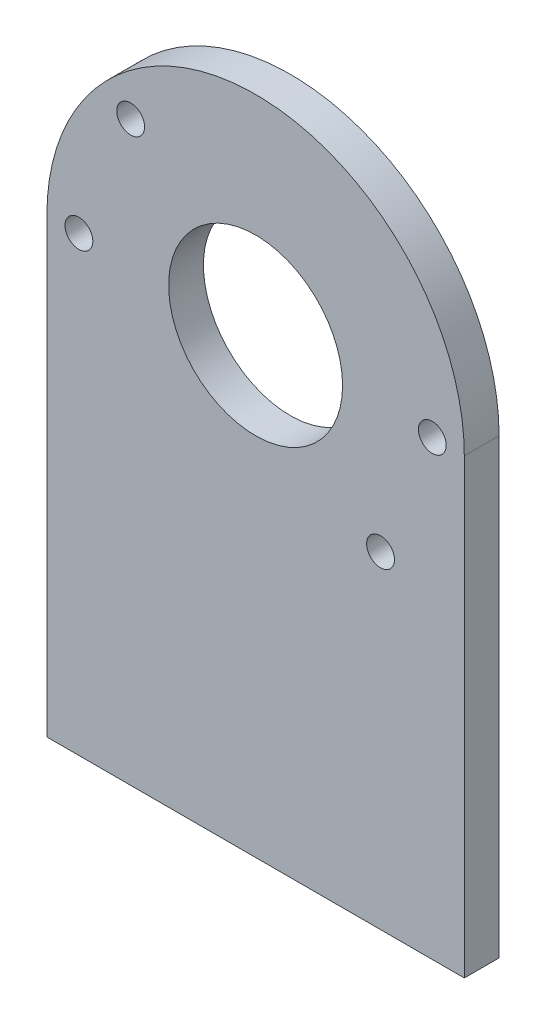
ISO-10303-21;
HEADER;
FILE_DESCRIPTION(('STEP AP214'),'2;1');
FILE_NAME('part.step','',(''),(''),'','','');
FILE_SCHEMA(('AUTOMOTIVE_DESIGN { 1 0 10303 214 1 1 1 1 }'));
ENDSEC;
DATA;
#1=APPLICATION_CONTEXT('core data for automotive mechanical design processes');
#2=APPLICATION_PROTOCOL_DEFINITION('international standard','automotive_design',2000,#1);
#3=PRODUCT_CONTEXT('',#1,'mechanical');
#4=PRODUCT('Part','Part','',(#3));
#5=PRODUCT_RELATED_PRODUCT_CATEGORY('part','',(#4));
#6=PRODUCT_DEFINITION_FORMATION('','',#4);
#7=PRODUCT_DEFINITION_CONTEXT('part definition',#1,'design');
#8=PRODUCT_DEFINITION('design','',#6,#7);
#9=PRODUCT_DEFINITION_SHAPE('','',#8);
#10=(LENGTH_UNIT() NAMED_UNIT(*) SI_UNIT(.MILLI.,.METRE.));
#11=(NAMED_UNIT(*) PLANE_ANGLE_UNIT() SI_UNIT($,.RADIAN.));
#12=(NAMED_UNIT(*) SI_UNIT($,.STERADIAN.) SOLID_ANGLE_UNIT());
#13=UNCERTAINTY_MEASURE_WITH_UNIT(LENGTH_MEASURE(1.E-05),#10,'distance_accuracy_value','');
#14=(GEOMETRIC_REPRESENTATION_CONTEXT(3) GLOBAL_UNCERTAINTY_ASSIGNED_CONTEXT((#13)) GLOBAL_UNIT_ASSIGNED_CONTEXT((#10,
#11,#12)) REPRESENTATION_CONTEXT('',''));
#15=CARTESIAN_POINT('',(0.,0.,0.));
#16=DIRECTION('',(0.,0.,1.));
#17=DIRECTION('',(1.,0.,0.));
#18=AXIS2_PLACEMENT_3D('',#15,#16,#17);
#19=CARTESIAN_POINT('',(0.,0.,5.));
#20=DIRECTION('',(0.,0.,1.));
#21=DIRECTION('',(1.,0.,0.));
#22=AXIS2_PLACEMENT_3D('',#19,#20,#21);
#23=PLANE('',#22);
#24=CARTESIAN_POINT('',(17.96,-17.96,5.));
#25=DIRECTION('',(0.,0.,1.));
#26=DIRECTION('',(1.,0.,0.));
#27=AXIS2_PLACEMENT_3D('',#24,#25,#26);
#28=CIRCLE('',#27,2.);
#29=CARTESIAN_POINT('',(19.96,-17.96,5.));
#30=VERTEX_POINT('',#29);
#31=EDGE_CURVE('E150',#30,#30,#28,.T.);
#32=ORIENTED_EDGE('',*,*,#31,.F.);
#33=EDGE_LOOP('',(#32));
#34=FACE_BOUND('',#33,.T.);
#35=CARTESIAN_POINT('',(-25.4,0.,5.));
#36=DIRECTION('',(0.,0.,1.));
#37=DIRECTION('',(1.,0.,0.));
#38=AXIS2_PLACEMENT_3D('',#35,#36,#37);
#39=CIRCLE('',#38,2.);
#40=CARTESIAN_POINT('',(-23.4,0.,5.));
#41=VERTEX_POINT('',#40);
#42=EDGE_CURVE('E134',#41,#41,#39,.T.);
#43=ORIENTED_EDGE('',*,*,#42,.F.);
#44=EDGE_LOOP('',(#43));
#45=FACE_BOUND('',#44,.T.);
#46=DIRECTION('',(0.,-1.,0.));
#47=VECTOR('',#46,1.);
#48=CARTESIAN_POINT('',(-30.,-65.,5.));
#49=LINE('',#48,#47);
#50=CARTESIAN_POINT('',(-30.,0.,5.));
#51=VERTEX_POINT('',#50);
#52=CARTESIAN_POINT('',(-30.,-65.,5.));
#53=VERTEX_POINT('',#52);
#54=EDGE_CURVE('E92',#51,#53,#49,.T.);
#55=ORIENTED_EDGE('',*,*,#54,.T.);
#56=DIRECTION('',(1.,0.,0.));
#57=VECTOR('',#56,1.);
#58=CARTESIAN_POINT('',(30.,-65.,5.));
#59=LINE('',#58,#57);
#60=CARTESIAN_POINT('',(30.,-65.,5.));
#61=VERTEX_POINT('',#60);
#62=EDGE_CURVE('E87',#53,#61,#59,.T.);
#63=ORIENTED_EDGE('',*,*,#62,.T.);
#64=DIRECTION('',(0.,1.,0.));
#65=VECTOR('',#64,1.);
#66=CARTESIAN_POINT('',(30.,-65.,5.));
#67=LINE('',#66,#65);
#68=CARTESIAN_POINT('',(30.,0.,5.));
#69=VERTEX_POINT('',#68);
#70=EDGE_CURVE('E90',#61,#69,#67,.T.);
#71=ORIENTED_EDGE('',*,*,#70,.T.);
#72=CARTESIAN_POINT('',(0.,0.,5.));
#73=DIRECTION('',(0.,0.,1.));
#74=DIRECTION('',(1.,0.,0.));
#75=AXIS2_PLACEMENT_3D('',#72,#73,#74);
#76=CIRCLE('',#75,30.);
#77=EDGE_CURVE('E57',#69,#51,#76,.T.);
#78=ORIENTED_EDGE('',*,*,#77,.T.);
#79=EDGE_LOOP('',(#55,#63,#71,#78));
#80=FACE_BOUND('',#79,.T.);
#81=CARTESIAN_POINT('',(-17.96,17.96,5.));
#82=DIRECTION('',(0.,0.,1.));
#83=DIRECTION('',(1.,0.,0.));
#84=AXIS2_PLACEMENT_3D('',#81,#82,#83);
#85=CIRCLE('',#84,2.);
#86=CARTESIAN_POINT('',(-15.96,17.96,5.));
#87=VERTEX_POINT('',#86);
#88=EDGE_CURVE('E112',#87,#87,#85,.T.);
#89=ORIENTED_EDGE('',*,*,#88,.F.);
#90=EDGE_LOOP('',(#89));
#91=FACE_BOUND('',#90,.T.);
#92=CARTESIAN_POINT('',(25.4,0.,5.));
#93=DIRECTION('',(0.,0.,1.));
#94=DIRECTION('',(-1.,0.,0.));
#95=AXIS2_PLACEMENT_3D('',#92,#93,#94);
#96=CIRCLE('',#95,2.);
#97=CARTESIAN_POINT('',(23.4,0.,5.));
#98=VERTEX_POINT('',#97);
#99=EDGE_CURVE('E142',#98,#98,#96,.T.);
#100=ORIENTED_EDGE('',*,*,#99,.F.);
#101=EDGE_LOOP('',(#100));
#102=FACE_BOUND('',#101,.T.);
#103=CARTESIAN_POINT('',(0.,0.,5.));
#104=DIRECTION('',(0.,0.,1.));
#105=DIRECTION('',(1.,0.,0.));
#106=AXIS2_PLACEMENT_3D('',#103,#104,#105);
#107=CIRCLE('',#106,12.5);
#108=CARTESIAN_POINT('',(12.5,0.,5.));
#109=VERTEX_POINT('',#108);
#110=EDGE_CURVE('E158',#109,#109,#107,.T.);
#111=ORIENTED_EDGE('',*,*,#110,.F.);
#112=EDGE_LOOP('',(#111));
#113=FACE_BOUND('',#112,.T.);
#114=ADVANCED_FACE('F39',(#34,#45,#80,#91,#102,#113),#23,.T.);
#115=CARTESIAN_POINT('',(0.,0.,0.));
#116=DIRECTION('',(0.,0.,1.));
#117=DIRECTION('',(1.,0.,0.));
#118=AXIS2_PLACEMENT_3D('',#115,#116,#117);
#119=PLANE('',#118);
#120=DIRECTION('',(0.,-1.,0.));
#121=VECTOR('',#120,1.);
#122=CARTESIAN_POINT('',(-30.,-65.,0.));
#123=LINE('',#122,#121);
#124=CARTESIAN_POINT('',(-30.,0.,0.));
#125=VERTEX_POINT('',#124);
#126=CARTESIAN_POINT('',(-30.,-65.,0.));
#127=VERTEX_POINT('',#126);
#128=EDGE_CURVE('E108',#125,#127,#123,.T.);
#129=ORIENTED_EDGE('',*,*,#128,.F.);
#130=CARTESIAN_POINT('',(0.,0.,0.));
#131=DIRECTION('',(0.,0.,1.));
#132=DIRECTION('',(1.,0.,0.));
#133=AXIS2_PLACEMENT_3D('',#130,#131,#132);
#134=CIRCLE('',#133,30.);
#135=CARTESIAN_POINT('',(30.,0.,0.));
#136=VERTEX_POINT('',#135);
#137=EDGE_CURVE('E80',#136,#125,#134,.T.);
#138=ORIENTED_EDGE('',*,*,#137,.F.);
#139=DIRECTION('',(0.,1.,0.));
#140=VECTOR('',#139,1.);
#141=CARTESIAN_POINT('',(30.,-65.,0.));
#142=LINE('',#141,#140);
#143=CARTESIAN_POINT('',(30.,-65.,0.));
#144=VERTEX_POINT('',#143);
#145=EDGE_CURVE('E74',#144,#136,#142,.T.);
#146=ORIENTED_EDGE('',*,*,#145,.F.);
#147=DIRECTION('',(1.,0.,0.));
#148=VECTOR('',#147,1.);
#149=CARTESIAN_POINT('',(30.,-65.,0.));
#150=LINE('',#149,#148);
#151=EDGE_CURVE('E97',#127,#144,#150,.T.);
#152=ORIENTED_EDGE('',*,*,#151,.F.);
#153=EDGE_LOOP('',(#129,#138,#146,#152));
#154=FACE_BOUND('',#153,.T.);
#155=CARTESIAN_POINT('',(-17.96,17.96,0.));
#156=DIRECTION('',(0.,0.,1.));
#157=DIRECTION('',(1.,0.,0.));
#158=AXIS2_PLACEMENT_3D('',#155,#156,#157);
#159=CIRCLE('',#158,2.);
#160=CARTESIAN_POINT('',(-15.96,17.96,0.));
#161=VERTEX_POINT('',#160);
#162=EDGE_CURVE('E130',#161,#161,#159,.T.);
#163=ORIENTED_EDGE('',*,*,#162,.T.);
#164=EDGE_LOOP('',(#163));
#165=FACE_BOUND('',#164,.T.);
#166=CARTESIAN_POINT('',(-25.4,0.,0.));
#167=DIRECTION('',(0.,0.,1.));
#168=DIRECTION('',(1.,0.,0.));
#169=AXIS2_PLACEMENT_3D('',#166,#167,#168);
#170=CIRCLE('',#169,2.);
#171=CARTESIAN_POINT('',(-23.4,0.,0.));
#172=VERTEX_POINT('',#171);
#173=EDGE_CURVE('E138',#172,#172,#170,.T.);
#174=ORIENTED_EDGE('',*,*,#173,.T.);
#175=EDGE_LOOP('',(#174));
#176=FACE_BOUND('',#175,.T.);
#177=CARTESIAN_POINT('',(25.4,0.,0.));
#178=DIRECTION('',(0.,0.,1.));
#179=DIRECTION('',(-1.,0.,0.));
#180=AXIS2_PLACEMENT_3D('',#177,#178,#179);
#181=CIRCLE('',#180,2.);
#182=CARTESIAN_POINT('',(23.4,0.,0.));
#183=VERTEX_POINT('',#182);
#184=EDGE_CURVE('E146',#183,#183,#181,.T.);
#185=ORIENTED_EDGE('',*,*,#184,.T.);
#186=EDGE_LOOP('',(#185));
#187=FACE_BOUND('',#186,.T.);
#188=CARTESIAN_POINT('',(17.96,-17.96,0.));
#189=DIRECTION('',(0.,0.,1.));
#190=DIRECTION('',(1.,0.,0.));
#191=AXIS2_PLACEMENT_3D('',#188,#189,#190);
#192=CIRCLE('',#191,2.);
#193=CARTESIAN_POINT('',(19.96,-17.96,0.));
#194=VERTEX_POINT('',#193);
#195=EDGE_CURVE('E154',#194,#194,#192,.T.);
#196=ORIENTED_EDGE('',*,*,#195,.T.);
#197=EDGE_LOOP('',(#196));
#198=FACE_BOUND('',#197,.T.);
#199=CARTESIAN_POINT('',(0.,0.,0.));
#200=DIRECTION('',(0.,0.,1.));
#201=DIRECTION('',(1.,0.,0.));
#202=AXIS2_PLACEMENT_3D('',#199,#200,#201);
#203=CIRCLE('',#202,12.5);
#204=CARTESIAN_POINT('',(12.5,0.,0.));
#205=VERTEX_POINT('',#204);
#206=EDGE_CURVE('E162',#205,#205,#203,.T.);
#207=ORIENTED_EDGE('',*,*,#206,.T.);
#208=EDGE_LOOP('',(#207));
#209=FACE_BOUND('',#208,.T.);
#210=ADVANCED_FACE('F125',(#154,#165,#176,#187,#198,#209),#119,.F.);
#211=CARTESIAN_POINT('',(-30.,-65.,5.));
#212=DIRECTION('',(1.,0.,0.));
#213=DIRECTION('',(0.,0.,-1.));
#214=AXIS2_PLACEMENT_3D('',#211,#212,#213);
#215=PLANE('',#214);
#216=ORIENTED_EDGE('',*,*,#128,.T.);
#217=DIRECTION('',(0.,0.,-1.));
#218=VECTOR('',#217,1.);
#219=CARTESIAN_POINT('',(-30.,-65.,5.));
#220=LINE('',#219,#218);
#221=EDGE_CURVE('E11',#53,#127,#220,.T.);
#222=ORIENTED_EDGE('',*,*,#221,.F.);
#223=ORIENTED_EDGE('',*,*,#54,.F.);
#224=DIRECTION('',(0.,0.,-1.));
#225=VECTOR('',#224,1.);
#226=CARTESIAN_POINT('',(-30.,0.,5.));
#227=LINE('',#226,#225);
#228=EDGE_CURVE('E104',#51,#125,#227,.T.);
#229=ORIENTED_EDGE('',*,*,#228,.T.);
#230=EDGE_LOOP('',(#216,#222,#223,#229));
#231=FACE_BOUND('',#230,.T.);
#232=ADVANCED_FACE('F41',(#231),#215,.F.);
#233=CARTESIAN_POINT('',(30.,-65.,5.));
#234=DIRECTION('',(0.,1.,0.));
#235=DIRECTION('',(0.,0.,1.));
#236=AXIS2_PLACEMENT_3D('',#233,#234,#235);
#237=PLANE('',#236);
#238=ORIENTED_EDGE('',*,*,#151,.T.);
#239=DIRECTION('',(0.,0.,-1.));
#240=VECTOR('',#239,1.);
#241=CARTESIAN_POINT('',(30.,-65.,5.));
#242=LINE('',#241,#240);
#243=EDGE_CURVE('E49',#61,#144,#242,.T.);
#244=ORIENTED_EDGE('',*,*,#243,.F.);
#245=ORIENTED_EDGE('',*,*,#62,.F.);
#246=ORIENTED_EDGE('',*,*,#221,.T.);
#247=EDGE_LOOP('',(#238,#244,#245,#246));
#248=FACE_BOUND('',#247,.T.);
#249=ADVANCED_FACE('F96',(#248),#237,.F.);
#250=CARTESIAN_POINT('',(30.,-65.,5.));
#251=DIRECTION('',(-1.,0.,0.));
#252=DIRECTION('',(0.,0.,1.));
#253=AXIS2_PLACEMENT_3D('',#250,#251,#252);
#254=PLANE('',#253);
#255=ORIENTED_EDGE('',*,*,#145,.T.);
#256=DIRECTION('',(0.,0.,-1.));
#257=VECTOR('',#256,1.);
#258=CARTESIAN_POINT('',(30.,0.,5.));
#259=LINE('',#258,#257);
#260=EDGE_CURVE('E99',#69,#136,#259,.T.);
#261=ORIENTED_EDGE('',*,*,#260,.F.);
#262=ORIENTED_EDGE('',*,*,#70,.F.);
#263=ORIENTED_EDGE('',*,*,#243,.T.);
#264=EDGE_LOOP('',(#255,#261,#262,#263));
#265=FACE_BOUND('',#264,.T.);
#266=ADVANCED_FACE('F100',(#265),#254,.F.);
#267=CARTESIAN_POINT('',(0.,0.,5.));
#268=DIRECTION('',(0.,0.,-1.));
#269=DIRECTION('',(-1.,0.,0.));
#270=AXIS2_PLACEMENT_3D('',#267,#268,#269);
#271=CYLINDRICAL_SURFACE('',#270,30.);
#272=ORIENTED_EDGE('',*,*,#137,.T.);
#273=ORIENTED_EDGE('',*,*,#228,.F.);
#274=ORIENTED_EDGE('',*,*,#77,.F.);
#275=ORIENTED_EDGE('',*,*,#260,.T.);
#276=EDGE_LOOP('',(#272,#273,#274,#275));
#277=FACE_BOUND('',#276,.T.);
#278=ADVANCED_FACE('F122',(#277),#271,.T.);
#279=CARTESIAN_POINT('',(-17.96,17.96,5.));
#280=DIRECTION('',(0.,0.,-1.));
#281=DIRECTION('',(-1.,0.,0.));
#282=AXIS2_PLACEMENT_3D('',#279,#280,#281);
#283=CYLINDRICAL_SURFACE('',#282,2.);
#284=ORIENTED_EDGE('',*,*,#88,.T.);
#285=EDGE_LOOP('',(#284));
#286=FACE_BOUND('',#285,.T.);
#287=ORIENTED_EDGE('',*,*,#162,.F.);
#288=EDGE_LOOP('',(#287));
#289=FACE_BOUND('',#288,.T.);
#290=ADVANCED_FACE('F183',(#286,#289),#283,.F.);
#291=CARTESIAN_POINT('',(-25.4,0.,5.));
#292=DIRECTION('',(0.,0.,-1.));
#293=DIRECTION('',(-1.,0.,0.));
#294=AXIS2_PLACEMENT_3D('',#291,#292,#293);
#295=CYLINDRICAL_SURFACE('',#294,2.);
#296=ORIENTED_EDGE('',*,*,#42,.T.);
#297=EDGE_LOOP('',(#296));
#298=FACE_BOUND('',#297,.T.);
#299=ORIENTED_EDGE('',*,*,#173,.F.);
#300=EDGE_LOOP('',(#299));
#301=FACE_BOUND('',#300,.T.);
#302=ADVANCED_FACE('F229',(#298,#301),#295,.F.);
#303=CARTESIAN_POINT('',(25.4,0.,5.));
#304=DIRECTION('',(0.,0.,-1.));
#305=DIRECTION('',(-1.,0.,0.));
#306=AXIS2_PLACEMENT_3D('',#303,#304,#305);
#307=CYLINDRICAL_SURFACE('',#306,2.);
#308=ORIENTED_EDGE('',*,*,#99,.T.);
#309=EDGE_LOOP('',(#308));
#310=FACE_BOUND('',#309,.T.);
#311=ORIENTED_EDGE('',*,*,#184,.F.);
#312=EDGE_LOOP('',(#311));
#313=FACE_BOUND('',#312,.T.);
#314=ADVANCED_FACE('F237',(#310,#313),#307,.F.);
#315=CARTESIAN_POINT('',(17.96,-17.96,5.));
#316=DIRECTION('',(0.,0.,-1.));
#317=DIRECTION('',(-1.,0.,0.));
#318=AXIS2_PLACEMENT_3D('',#315,#316,#317);
#319=CYLINDRICAL_SURFACE('',#318,2.);
#320=ORIENTED_EDGE('',*,*,#31,.T.);
#321=EDGE_LOOP('',(#320));
#322=FACE_BOUND('',#321,.T.);
#323=ORIENTED_EDGE('',*,*,#195,.F.);
#324=EDGE_LOOP('',(#323));
#325=FACE_BOUND('',#324,.T.);
#326=ADVANCED_FACE('F245',(#322,#325),#319,.F.);
#327=CARTESIAN_POINT('',(0.,0.,5.));
#328=DIRECTION('',(0.,0.,-1.));
#329=DIRECTION('',(-1.,0.,0.));
#330=AXIS2_PLACEMENT_3D('',#327,#328,#329);
#331=CYLINDRICAL_SURFACE('',#330,12.5);
#332=ORIENTED_EDGE('',*,*,#110,.T.);
#333=EDGE_LOOP('',(#332));
#334=FACE_BOUND('',#333,.T.);
#335=ORIENTED_EDGE('',*,*,#206,.F.);
#336=EDGE_LOOP('',(#335));
#337=FACE_BOUND('',#336,.T.);
#338=ADVANCED_FACE('F170',(#334,#337),#331,.F.);
#339=CLOSED_SHELL('',(#114,#210,#232,#249,#266,#278,#290,#302,#314,#326,#338));
#340=MANIFOLD_SOLID_BREP('B2',#339);
#341=ADVANCED_BREP_SHAPE_REPRESENTATION('',(#18,#340),#14);
#342=SHAPE_DEFINITION_REPRESENTATION(#9,#341);
ENDSEC;
END-ISO-10303-21;
